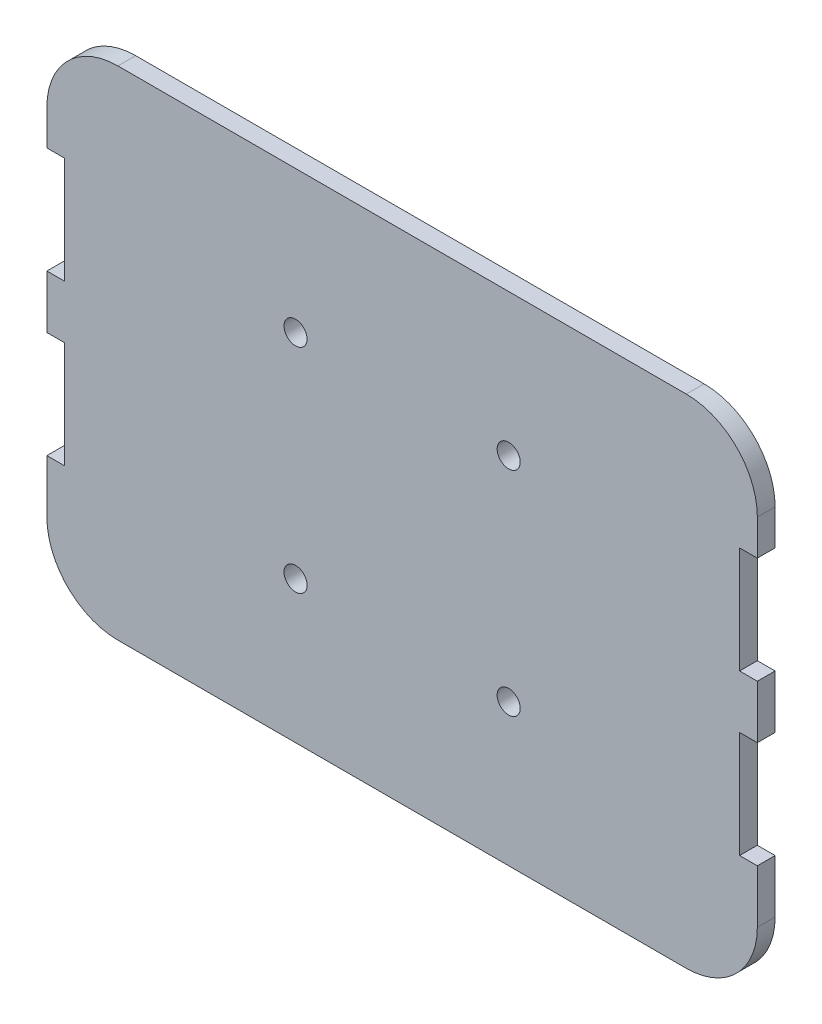
ISO-10303-21;
HEADER;
FILE_DESCRIPTION(('STEP AP214'),'2;1');
FILE_NAME('part.step','',(''),(''),'','','');
FILE_SCHEMA(('AUTOMOTIVE_DESIGN { 1 0 10303 214 1 1 1 1 }'));
ENDSEC;
DATA;
#1=APPLICATION_CONTEXT('core data for automotive mechanical design processes');
#2=APPLICATION_PROTOCOL_DEFINITION('international standard','automotive_design',2000,#1);
#3=PRODUCT_CONTEXT('',#1,'mechanical');
#4=PRODUCT('Part','Part','',(#3));
#5=PRODUCT_RELATED_PRODUCT_CATEGORY('part','',(#4));
#6=PRODUCT_DEFINITION_FORMATION('','',#4);
#7=PRODUCT_DEFINITION_CONTEXT('part definition',#1,'design');
#8=PRODUCT_DEFINITION('design','',#6,#7);
#9=PRODUCT_DEFINITION_SHAPE('','',#8);
#10=(LENGTH_UNIT() NAMED_UNIT(*) SI_UNIT(.MILLI.,.METRE.));
#11=(NAMED_UNIT(*) PLANE_ANGLE_UNIT() SI_UNIT($,.RADIAN.));
#12=(NAMED_UNIT(*) SI_UNIT($,.STERADIAN.) SOLID_ANGLE_UNIT());
#13=UNCERTAINTY_MEASURE_WITH_UNIT(LENGTH_MEASURE(1.E-05),#10,'distance_accuracy_value','');
#14=(GEOMETRIC_REPRESENTATION_CONTEXT(3) GLOBAL_UNCERTAINTY_ASSIGNED_CONTEXT((#13)) GLOBAL_UNIT_ASSIGNED_CONTEXT((#10,
#11,#12)) REPRESENTATION_CONTEXT('',''));
#15=CARTESIAN_POINT('',(0.,0.,0.));
#16=DIRECTION('',(0.,0.,1.));
#17=DIRECTION('',(1.,0.,0.));
#18=AXIS2_PLACEMENT_3D('',#15,#16,#17);
#19=CARTESIAN_POINT('',(-100.,120.,5.));
#20=DIRECTION('',(1.,0.,0.));
#21=DIRECTION('',(0.,0.,-1.));
#22=AXIS2_PLACEMENT_3D('',#19,#20,#21);
#23=PLANE('',#22);
#24=DIRECTION('',(0.,-1.,0.));
#25=VECTOR('',#24,1.);
#26=CARTESIAN_POINT('',(-100.,120.,0.));
#27=LINE('',#26,#25);
#28=CARTESIAN_POINT('',(-100.,100.,0.));
#29=VERTEX_POINT('',#28);
#30=CARTESIAN_POINT('',(-100.,90.,0.));
#31=VERTEX_POINT('',#30);
#32=EDGE_CURVE('E364',#29,#31,#27,.T.);
#33=ORIENTED_EDGE('',*,*,#32,.T.);
#34=DIRECTION('',(0.,0.,1.));
#35=VECTOR('',#34,1.);
#36=CARTESIAN_POINT('',(-100.,90.,5.));
#37=LINE('',#36,#35);
#38=CARTESIAN_POINT('',(-100.,90.,5.));
#39=VERTEX_POINT('',#38);
#40=EDGE_CURVE('E443',#31,#39,#37,.T.);
#41=ORIENTED_EDGE('',*,*,#40,.T.);
#42=DIRECTION('',(0.,-1.,0.));
#43=VECTOR('',#42,1.);
#44=CARTESIAN_POINT('',(-100.,120.,5.));
#45=LINE('',#44,#43);
#46=CARTESIAN_POINT('',(-100.,100.,5.));
#47=VERTEX_POINT('',#46);
#48=EDGE_CURVE('E373',#47,#39,#45,.T.);
#49=ORIENTED_EDGE('',*,*,#48,.F.);
#50=DIRECTION('',(0.,0.,-1.));
#51=VECTOR('',#50,1.);
#52=CARTESIAN_POINT('',(-100.,100.,0.));
#53=LINE('',#52,#51);
#54=EDGE_CURVE('E393',#47,#29,#53,.T.);
#55=ORIENTED_EDGE('',*,*,#54,.T.);
#56=EDGE_LOOP('',(#33,#41,#49,#55));
#57=FACE_BOUND('',#56,.T.);
#58=ADVANCED_FACE('F95',(#57),#23,.F.);
#59=CARTESIAN_POINT('',(-100.,60.,5.));
#60=VERTEX_POINT('',#59);
#61=CARTESIAN_POINT('',(-100.,45.,5.));
#62=VERTEX_POINT('',#61);
#63=EDGE_CURVE('E376',#60,#62,#45,.T.);
#64=ORIENTED_EDGE('',*,*,#63,.F.);
#65=DIRECTION('',(0.,0.,-1.));
#66=VECTOR('',#65,1.);
#67=CARTESIAN_POINT('',(-100.,60.,5.));
#68=LINE('',#67,#66);
#69=CARTESIAN_POINT('',(-100.,60.,0.));
#70=VERTEX_POINT('',#69);
#71=EDGE_CURVE('E441',#60,#70,#68,.T.);
#72=ORIENTED_EDGE('',*,*,#71,.T.);
#73=CARTESIAN_POINT('',(-100.,45.,0.));
#74=VERTEX_POINT('',#73);
#75=EDGE_CURVE('E390',#70,#74,#27,.T.);
#76=ORIENTED_EDGE('',*,*,#75,.T.);
#77=DIRECTION('',(0.,0.,1.));
#78=VECTOR('',#77,1.);
#79=CARTESIAN_POINT('',(-100.,45.,5.));
#80=LINE('',#79,#78);
#81=EDGE_CURVE('E438',#74,#62,#80,.T.);
#82=ORIENTED_EDGE('',*,*,#81,.T.);
#83=EDGE_LOOP('',(#64,#72,#76,#82));
#84=FACE_BOUND('',#83,.T.);
#85=ADVANCED_FACE('F469',(#84),#23,.F.);
#86=CARTESIAN_POINT('',(100.,120.,5.));
#87=DIRECTION('',(1.,0.,0.));
#88=DIRECTION('',(0.,1.,0.));
#89=AXIS2_PLACEMENT_3D('',#86,#87,#88);
#90=PLANE('',#89);
#91=DIRECTION('',(0.,0.,1.));
#92=VECTOR('',#91,1.);
#93=CARTESIAN_POINT('',(100.,45.,5.));
#94=LINE('',#93,#92);
#95=CARTESIAN_POINT('',(100.,45.,0.));
#96=VERTEX_POINT('',#95);
#97=CARTESIAN_POINT('',(100.,45.,5.));
#98=VERTEX_POINT('',#97);
#99=EDGE_CURVE('E434',#96,#98,#94,.T.);
#100=ORIENTED_EDGE('',*,*,#99,.F.);
#101=DIRECTION('',(0.,-1.,0.));
#102=VECTOR('',#101,1.);
#103=CARTESIAN_POINT('',(100.,120.,0.));
#104=LINE('',#103,#102);
#105=CARTESIAN_POINT('',(100.,60.,0.));
#106=VERTEX_POINT('',#105);
#107=EDGE_CURVE('E384',#106,#96,#104,.T.);
#108=ORIENTED_EDGE('',*,*,#107,.F.);
#109=DIRECTION('',(0.,0.,-1.));
#110=VECTOR('',#109,1.);
#111=CARTESIAN_POINT('',(100.,60.,5.));
#112=LINE('',#111,#110);
#113=CARTESIAN_POINT('',(100.,60.,5.));
#114=VERTEX_POINT('',#113);
#115=EDGE_CURVE('E428',#114,#106,#112,.T.);
#116=ORIENTED_EDGE('',*,*,#115,.F.);
#117=DIRECTION('',(0.,-1.,0.));
#118=VECTOR('',#117,1.);
#119=CARTESIAN_POINT('',(100.,120.,5.));
#120=LINE('',#119,#118);
#121=EDGE_CURVE('E369',#114,#98,#120,.T.);
#122=ORIENTED_EDGE('',*,*,#121,.T.);
#123=EDGE_LOOP('',(#100,#108,#116,#122));
#124=FACE_BOUND('',#123,.T.);
#125=ADVANCED_FACE('F500',(#124),#90,.T.);
#126=DIRECTION('',(0.,0.,1.));
#127=VECTOR('',#126,1.);
#128=CARTESIAN_POINT('',(100.,90.,5.));
#129=LINE('',#128,#127);
#130=CARTESIAN_POINT('',(100.,90.,0.));
#131=VERTEX_POINT('',#130);
#132=CARTESIAN_POINT('',(100.,90.,5.));
#133=VERTEX_POINT('',#132);
#134=EDGE_CURVE('E430',#131,#133,#129,.T.);
#135=ORIENTED_EDGE('',*,*,#134,.F.);
#136=CARTESIAN_POINT('',(100.,100.,0.));
#137=VERTEX_POINT('',#136);
#138=EDGE_CURVE('E380',#137,#131,#104,.T.);
#139=ORIENTED_EDGE('',*,*,#138,.F.);
#140=DIRECTION('',(0.,0.,-1.));
#141=VECTOR('',#140,1.);
#142=CARTESIAN_POINT('',(100.,100.,5.));
#143=LINE('',#142,#141);
#144=CARTESIAN_POINT('',(100.,100.,5.));
#145=VERTEX_POINT('',#144);
#146=EDGE_CURVE('E423',#137,#145,#143,.F.);
#147=ORIENTED_EDGE('',*,*,#146,.T.);
#148=EDGE_CURVE('E365',#145,#133,#120,.T.);
#149=ORIENTED_EDGE('',*,*,#148,.T.);
#150=EDGE_LOOP('',(#135,#139,#147,#149));
#151=FACE_BOUND('',#150,.T.);
#152=ADVANCED_FACE('F523',(#151),#90,.T.);
#153=CARTESIAN_POINT('',(0.,0.,5.));
#154=DIRECTION('',(0.,0.,-1.));
#155=DIRECTION('',(-1.,0.,0.));
#156=AXIS2_PLACEMENT_3D('',#153,#154,#155);
#157=PLANE('',#156);
#158=CARTESIAN_POINT('',(-30.,80.,5.));
#159=DIRECTION('',(0.,0.,-1.));
#160=DIRECTION('',(-1.,0.,0.));
#161=AXIS2_PLACEMENT_3D('',#158,#159,#160);
#162=CIRCLE('',#161,3.25000000000001);
#163=CARTESIAN_POINT('',(-33.25,80.,5.));
#164=VERTEX_POINT('',#163);
#165=EDGE_CURVE('E343',#164,#164,#162,.T.);
#166=ORIENTED_EDGE('',*,*,#165,.T.);
#167=EDGE_LOOP('',(#166));
#168=FACE_BOUND('',#167,.T.);
#169=CARTESIAN_POINT('',(30.,20.,5.));
#170=DIRECTION('',(0.,0.,-1.));
#171=DIRECTION('',(-1.,0.,0.));
#172=AXIS2_PLACEMENT_3D('',#169,#170,#171);
#173=CIRCLE('',#172,3.25000000000001);
#174=CARTESIAN_POINT('',(26.75,20.,5.));
#175=VERTEX_POINT('',#174);
#176=EDGE_CURVE('E355',#175,#175,#173,.T.);
#177=ORIENTED_EDGE('',*,*,#176,.T.);
#178=EDGE_LOOP('',(#177));
#179=FACE_BOUND('',#178,.T.);
#180=ORIENTED_EDGE('',*,*,#48,.T.);
#181=DIRECTION('',(-1.,0.,0.));
#182=VECTOR('',#181,1.);
#183=CARTESIAN_POINT('',(-94.9999999999999,90.,5.));
#184=LINE('',#183,#182);
#185=CARTESIAN_POINT('',(-94.9999999999999,90.,5.));
#186=VERTEX_POINT('',#185);
#187=EDGE_CURVE('E301',#186,#39,#184,.T.);
#188=ORIENTED_EDGE('',*,*,#187,.F.);
#189=DIRECTION('',(0.,1.,0.));
#190=VECTOR('',#189,1.);
#191=CARTESIAN_POINT('',(-94.9999999999999,90.,5.));
#192=LINE('',#191,#190);
#193=CARTESIAN_POINT('',(-94.9999999999999,60.,5.));
#194=VERTEX_POINT('',#193);
#195=EDGE_CURVE('E306',#194,#186,#192,.T.);
#196=ORIENTED_EDGE('',*,*,#195,.F.);
#197=DIRECTION('',(1.,0.,0.));
#198=VECTOR('',#197,1.);
#199=CARTESIAN_POINT('',(-94.9999999999999,60.,5.));
#200=LINE('',#199,#198);
#201=EDGE_CURVE('E303',#60,#194,#200,.T.);
#202=ORIENTED_EDGE('',*,*,#201,.F.);
#203=ORIENTED_EDGE('',*,*,#63,.T.);
#204=DIRECTION('',(-1.,0.,0.));
#205=VECTOR('',#204,1.);
#206=CARTESIAN_POINT('',(-95.,45.,5.));
#207=LINE('',#206,#205);
#208=CARTESIAN_POINT('',(-95.,45.,5.));
#209=VERTEX_POINT('',#208);
#210=EDGE_CURVE('E289',#209,#62,#207,.T.);
#211=ORIENTED_EDGE('',*,*,#210,.F.);
#212=DIRECTION('',(0.,1.,0.));
#213=VECTOR('',#212,1.);
#214=CARTESIAN_POINT('',(-95.,45.,5.));
#215=LINE('',#214,#213);
#216=CARTESIAN_POINT('',(-95.,15.,5.));
#217=VERTEX_POINT('',#216);
#218=EDGE_CURVE('E295',#217,#209,#215,.T.);
#219=ORIENTED_EDGE('',*,*,#218,.F.);
#220=DIRECTION('',(1.,0.,0.));
#221=VECTOR('',#220,1.);
#222=CARTESIAN_POINT('',(-95.,15.,5.));
#223=LINE('',#222,#221);
#224=CARTESIAN_POINT('',(-100.,15.,5.));
#225=VERTEX_POINT('',#224);
#226=EDGE_CURVE('E291',#225,#217,#223,.T.);
#227=ORIENTED_EDGE('',*,*,#226,.F.);
#228=CARTESIAN_POINT('',(-100.,0.,5.));
#229=VERTEX_POINT('',#228);
#230=EDGE_CURVE('E372',#225,#229,#45,.T.);
#231=ORIENTED_EDGE('',*,*,#230,.T.);
#232=CARTESIAN_POINT('',(-80.,0.,5.));
#233=DIRECTION('',(0.,0.,-1.));
#234=DIRECTION('',(-1.,0.,0.));
#235=AXIS2_PLACEMENT_3D('',#232,#233,#234);
#236=CIRCLE('',#235,20.);
#237=CARTESIAN_POINT('',(-80.,-20.,5.));
#238=VERTEX_POINT('',#237);
#239=EDGE_CURVE('E414',#229,#238,#236,.F.);
#240=ORIENTED_EDGE('',*,*,#239,.T.);
#241=DIRECTION('',(1.,0.,0.));
#242=VECTOR('',#241,1.);
#243=CARTESIAN_POINT('',(-100.,-20.,5.));
#244=LINE('',#243,#242);
#245=CARTESIAN_POINT('',(79.9999999999999,-20.,5.));
#246=VERTEX_POINT('',#245);
#247=EDGE_CURVE('E368',#238,#246,#244,.T.);
#248=ORIENTED_EDGE('',*,*,#247,.T.);
#249=CARTESIAN_POINT('',(80.,0.,5.));
#250=DIRECTION('',(0.,0.,-1.));
#251=DIRECTION('',(-1.,0.,0.));
#252=AXIS2_PLACEMENT_3D('',#249,#250,#251);
#253=CIRCLE('',#252,20.);
#254=CARTESIAN_POINT('',(100.,0.,5.));
#255=VERTEX_POINT('',#254);
#256=EDGE_CURVE('E412',#246,#255,#253,.F.);
#257=ORIENTED_EDGE('',*,*,#256,.T.);
#258=CARTESIAN_POINT('',(100.,15.,5.));
#259=VERTEX_POINT('',#258);
#260=EDGE_CURVE('E283',#259,#255,#120,.T.);
#261=ORIENTED_EDGE('',*,*,#260,.F.);
#262=DIRECTION('',(1.,0.,0.));
#263=VECTOR('',#262,1.);
#264=CARTESIAN_POINT('',(95.,15.,5.));
#265=LINE('',#264,#263);
#266=CARTESIAN_POINT('',(95.,15.,5.));
#267=VERTEX_POINT('',#266);
#268=EDGE_CURVE('E260',#267,#259,#265,.T.);
#269=ORIENTED_EDGE('',*,*,#268,.F.);
#270=DIRECTION('',(0.,-1.,0.));
#271=VECTOR('',#270,1.);
#272=CARTESIAN_POINT('',(95.,45.,5.));
#273=LINE('',#272,#271);
#274=CARTESIAN_POINT('',(95.,45.,5.));
#275=VERTEX_POINT('',#274);
#276=EDGE_CURVE('E270',#275,#267,#273,.T.);
#277=ORIENTED_EDGE('',*,*,#276,.F.);
#278=DIRECTION('',(-1.,0.,0.));
#279=VECTOR('',#278,1.);
#280=CARTESIAN_POINT('',(95.,45.,5.));
#281=LINE('',#280,#279);
#282=EDGE_CURVE('E267',#98,#275,#281,.T.);
#283=ORIENTED_EDGE('',*,*,#282,.F.);
#284=ORIENTED_EDGE('',*,*,#121,.F.);
#285=DIRECTION('',(1.,0.,0.));
#286=VECTOR('',#285,1.);
#287=CARTESIAN_POINT('',(95.,60.,5.));
#288=LINE('',#287,#286);
#289=CARTESIAN_POINT('',(95.,60.,5.));
#290=VERTEX_POINT('',#289);
#291=EDGE_CURVE('E314',#290,#114,#288,.T.);
#292=ORIENTED_EDGE('',*,*,#291,.F.);
#293=DIRECTION('',(0.,-1.,0.));
#294=VECTOR('',#293,1.);
#295=CARTESIAN_POINT('',(95.,90.,5.));
#296=LINE('',#295,#294);
#297=CARTESIAN_POINT('',(95.,90.,5.));
#298=VERTEX_POINT('',#297);
#299=EDGE_CURVE('E287',#298,#290,#296,.T.);
#300=ORIENTED_EDGE('',*,*,#299,.F.);
#301=DIRECTION('',(-1.,0.,0.));
#302=VECTOR('',#301,1.);
#303=CARTESIAN_POINT('',(95.,90.,5.));
#304=LINE('',#303,#302);
#305=EDGE_CURVE('E316',#133,#298,#304,.T.);
#306=ORIENTED_EDGE('',*,*,#305,.F.);
#307=ORIENTED_EDGE('',*,*,#148,.F.);
#308=CARTESIAN_POINT('',(80.,100.,5.));
#309=DIRECTION('',(0.,0.,-1.));
#310=DIRECTION('',(-1.,0.,0.));
#311=AXIS2_PLACEMENT_3D('',#308,#309,#310);
#312=CIRCLE('',#311,20.);
#313=CARTESIAN_POINT('',(80.,120.,5.));
#314=VERTEX_POINT('',#313);
#315=EDGE_CURVE('E410',#145,#314,#312,.F.);
#316=ORIENTED_EDGE('',*,*,#315,.T.);
#317=DIRECTION('',(1.,0.,0.));
#318=VECTOR('',#317,1.);
#319=CARTESIAN_POINT('',(-100.,120.,5.));
#320=LINE('',#319,#318);
#321=CARTESIAN_POINT('',(-80.,120.,5.));
#322=VERTEX_POINT('',#321);
#323=EDGE_CURVE('E361',#322,#314,#320,.T.);
#324=ORIENTED_EDGE('',*,*,#323,.F.);
#325=CARTESIAN_POINT('',(-80.,100.,5.));
#326=DIRECTION('',(0.,0.,-1.));
#327=DIRECTION('',(-1.,0.,0.));
#328=AXIS2_PLACEMENT_3D('',#325,#326,#327);
#329=CIRCLE('',#328,20.);
#330=EDGE_CURVE('E416',#322,#47,#329,.F.);
#331=ORIENTED_EDGE('',*,*,#330,.T.);
#332=EDGE_LOOP('',(#180,#188,#196,#202,#203,#211,#219,#227,#231,#240,#248,#257,#261,#269,#277,
#283,#284,#292,#300,#306,#307,#316,#324,#331));
#333=FACE_BOUND('',#332,.T.);
#334=CARTESIAN_POINT('',(-30.,20.,5.));
#335=DIRECTION('',(0.,0.,1.));
#336=DIRECTION('',(1.,0.,0.));
#337=AXIS2_PLACEMENT_3D('',#334,#335,#336);
#338=CIRCLE('',#337,3.25000000000001);
#339=CARTESIAN_POINT('',(-26.75,20.,5.));
#340=VERTEX_POINT('',#339);
#341=EDGE_CURVE('E349',#340,#340,#338,.T.);
#342=ORIENTED_EDGE('',*,*,#341,.F.);
#343=EDGE_LOOP('',(#342));
#344=FACE_BOUND('',#343,.T.);
#345=CARTESIAN_POINT('',(30.,80.,5.));
#346=DIRECTION('',(0.,0.,1.));
#347=DIRECTION('',(1.,0.,0.));
#348=AXIS2_PLACEMENT_3D('',#345,#346,#347);
#349=CIRCLE('',#348,3.25);
#350=CARTESIAN_POINT('',(33.25,80.,5.));
#351=VERTEX_POINT('',#350);
#352=EDGE_CURVE('E337',#351,#351,#349,.T.);
#353=ORIENTED_EDGE('',*,*,#352,.F.);
#354=EDGE_LOOP('',(#353));
#355=FACE_BOUND('',#354,.T.);
#356=ADVANCED_FACE('F280',(#168,#179,#333,#344,#355),#157,.F.);
#357=CARTESIAN_POINT('',(0.,0.,0.));
#358=DIRECTION('',(0.,0.,-1.));
#359=DIRECTION('',(-1.,0.,0.));
#360=AXIS2_PLACEMENT_3D('',#357,#358,#359);
#361=PLANE('',#360);
#362=DIRECTION('',(1.,0.,0.));
#363=VECTOR('',#362,1.);
#364=CARTESIAN_POINT('',(-4.99600361081315E-13,90.0000000000006,0.));
#365=LINE('',#364,#363);
#366=CARTESIAN_POINT('',(-94.9999999999999,90.,0.));
#367=VERTEX_POINT('',#366);
#368=EDGE_CURVE('E334',#31,#367,#365,.T.);
#369=ORIENTED_EDGE('',*,*,#368,.F.);
#370=ORIENTED_EDGE('',*,*,#32,.F.);
#371=CARTESIAN_POINT('',(-80.,100.,0.));
#372=DIRECTION('',(0.,0.,-1.));
#373=DIRECTION('',(-1.,0.,0.));
#374=AXIS2_PLACEMENT_3D('',#371,#372,#373);
#375=CIRCLE('',#374,20.);
#376=CARTESIAN_POINT('',(-80.,120.,0.));
#377=VERTEX_POINT('',#376);
#378=EDGE_CURVE('E403',#29,#377,#375,.T.);
#379=ORIENTED_EDGE('',*,*,#378,.T.);
#380=DIRECTION('',(1.,0.,0.));
#381=VECTOR('',#380,1.);
#382=CARTESIAN_POINT('',(-100.,120.,0.));
#383=LINE('',#382,#381);
#384=CARTESIAN_POINT('',(80.,120.,0.));
#385=VERTEX_POINT('',#384);
#386=EDGE_CURVE('E358',#377,#385,#383,.T.);
#387=ORIENTED_EDGE('',*,*,#386,.T.);
#388=CARTESIAN_POINT('',(80.,100.,0.));
#389=DIRECTION('',(0.,0.,-1.));
#390=DIRECTION('',(-1.,0.,0.));
#391=AXIS2_PLACEMENT_3D('',#388,#389,#390);
#392=CIRCLE('',#391,20.);
#393=EDGE_CURVE('E396',#385,#137,#392,.T.);
#394=ORIENTED_EDGE('',*,*,#393,.T.);
#395=ORIENTED_EDGE('',*,*,#138,.T.);
#396=DIRECTION('',(1.,0.,0.));
#397=VECTOR('',#396,1.);
#398=CARTESIAN_POINT('',(0.,90.,0.));
#399=LINE('',#398,#397);
#400=CARTESIAN_POINT('',(95.,90.,0.));
#401=VERTEX_POINT('',#400);
#402=EDGE_CURVE('E325',#401,#131,#399,.T.);
#403=ORIENTED_EDGE('',*,*,#402,.F.);
#404=DIRECTION('',(0.,1.,0.));
#405=VECTOR('',#404,1.);
#406=CARTESIAN_POINT('',(94.9999999999999,0.,0.));
#407=LINE('',#406,#405);
#408=CARTESIAN_POINT('',(95.,60.,0.));
#409=VERTEX_POINT('',#408);
#410=EDGE_CURVE('E446',#409,#401,#407,.T.);
#411=ORIENTED_EDGE('',*,*,#410,.F.);
#412=DIRECTION('',(-1.,0.,0.));
#413=VECTOR('',#412,1.);
#414=CARTESIAN_POINT('',(0.,60.,0.));
#415=LINE('',#414,#413);
#416=EDGE_CURVE('E322',#106,#409,#415,.T.);
#417=ORIENTED_EDGE('',*,*,#416,.F.);
#418=ORIENTED_EDGE('',*,*,#107,.T.);
#419=DIRECTION('',(1.,0.,0.));
#420=VECTOR('',#419,1.);
#421=CARTESIAN_POINT('',(0.,45.,0.));
#422=LINE('',#421,#420);
#423=CARTESIAN_POINT('',(95.,45.,0.));
#424=VERTEX_POINT('',#423);
#425=EDGE_CURVE('E328',#424,#96,#422,.T.);
#426=ORIENTED_EDGE('',*,*,#425,.F.);
#427=DIRECTION('',(0.,1.,0.));
#428=VECTOR('',#427,1.);
#429=CARTESIAN_POINT('',(95.,0.,0.));
#430=LINE('',#429,#428);
#431=CARTESIAN_POINT('',(95.,15.,0.));
#432=VERTEX_POINT('',#431);
#433=EDGE_CURVE('E448',#432,#424,#430,.T.);
#434=ORIENTED_EDGE('',*,*,#433,.F.);
#435=DIRECTION('',(-1.,0.,0.));
#436=VECTOR('',#435,1.);
#437=CARTESIAN_POINT('',(0.,15.,0.));
#438=LINE('',#437,#436);
#439=CARTESIAN_POINT('',(100.,15.,0.));
#440=VERTEX_POINT('',#439);
#441=EDGE_CURVE('E263',#440,#432,#438,.T.);
#442=ORIENTED_EDGE('',*,*,#441,.F.);
#443=CARTESIAN_POINT('',(100.,0.,0.));
#444=VERTEX_POINT('',#443);
#445=EDGE_CURVE('E379',#440,#444,#104,.T.);
#446=ORIENTED_EDGE('',*,*,#445,.T.);
#447=CARTESIAN_POINT('',(80.,0.,0.));
#448=DIRECTION('',(0.,0.,-1.));
#449=DIRECTION('',(-1.,0.,0.));
#450=AXIS2_PLACEMENT_3D('',#447,#448,#449);
#451=CIRCLE('',#450,20.);
#452=CARTESIAN_POINT('',(79.9999999999999,-20.,0.));
#453=VERTEX_POINT('',#452);
#454=EDGE_CURVE('E398',#444,#453,#451,.T.);
#455=ORIENTED_EDGE('',*,*,#454,.T.);
#456=DIRECTION('',(1.,0.,0.));
#457=VECTOR('',#456,1.);
#458=CARTESIAN_POINT('',(-100.,-20.,0.));
#459=LINE('',#458,#457);
#460=CARTESIAN_POINT('',(-80.,-20.,0.));
#461=VERTEX_POINT('',#460);
#462=EDGE_CURVE('E383',#461,#453,#459,.T.);
#463=ORIENTED_EDGE('',*,*,#462,.F.);
#464=CARTESIAN_POINT('',(-80.,0.,0.));
#465=DIRECTION('',(0.,0.,-1.));
#466=DIRECTION('',(-1.,0.,0.));
#467=AXIS2_PLACEMENT_3D('',#464,#465,#466);
#468=CIRCLE('',#467,20.);
#469=CARTESIAN_POINT('',(-100.,0.,0.));
#470=VERTEX_POINT('',#469);
#471=EDGE_CURVE('E400',#461,#470,#468,.T.);
#472=ORIENTED_EDGE('',*,*,#471,.T.);
#473=CARTESIAN_POINT('',(-100.,15.,0.));
#474=VERTEX_POINT('',#473);
#475=EDGE_CURVE('E387',#474,#470,#27,.T.);
#476=ORIENTED_EDGE('',*,*,#475,.F.);
#477=DIRECTION('',(-1.,0.,0.));
#478=VECTOR('',#477,1.);
#479=CARTESIAN_POINT('',(0.,14.9999999999995,0.));
#480=LINE('',#479,#478);
#481=CARTESIAN_POINT('',(-95.,15.,0.));
#482=VERTEX_POINT('',#481);
#483=EDGE_CURVE('E110',#482,#474,#480,.T.);
#484=ORIENTED_EDGE('',*,*,#483,.F.);
#485=DIRECTION('',(0.,-1.,0.));
#486=VECTOR('',#485,1.);
#487=CARTESIAN_POINT('',(-95.,0.,0.));
#488=LINE('',#487,#486);
#489=CARTESIAN_POINT('',(-95.,45.,0.));
#490=VERTEX_POINT('',#489);
#491=EDGE_CURVE('E103',#490,#482,#488,.T.);
#492=ORIENTED_EDGE('',*,*,#491,.F.);
#493=DIRECTION('',(1.,0.,0.));
#494=VECTOR('',#493,1.);
#495=CARTESIAN_POINT('',(1.87350135405492E-13,44.9999999999996,0.));
#496=LINE('',#495,#494);
#497=EDGE_CURVE('E331',#74,#490,#496,.T.);
#498=ORIENTED_EDGE('',*,*,#497,.F.);
#499=ORIENTED_EDGE('',*,*,#75,.F.);
#500=DIRECTION('',(-1.,0.,0.));
#501=VECTOR('',#500,1.);
#502=CARTESIAN_POINT('',(2.49800180540654E-13,59.9999999999996,0.));
#503=LINE('',#502,#501);
#504=CARTESIAN_POINT('',(-94.9999999999999,60.,0.));
#505=VERTEX_POINT('',#504);
#506=EDGE_CURVE('E118',#505,#70,#503,.T.);
#507=ORIENTED_EDGE('',*,*,#506,.F.);
#508=DIRECTION('',(0.,-1.,0.));
#509=VECTOR('',#508,1.);
#510=CARTESIAN_POINT('',(-94.9999999999999,0.,0.));
#511=LINE('',#510,#509);
#512=EDGE_CURVE('E12',#367,#505,#511,.T.);
#513=ORIENTED_EDGE('',*,*,#512,.F.);
#514=EDGE_LOOP('',(#369,#370,#379,#387,#394,#395,#403,#411,#417,#418,#426,#434,#442,#446,#455,
#463,#472,#476,#484,#492,#498,#499,#507,#513));
#515=FACE_BOUND('',#514,.T.);
#516=CARTESIAN_POINT('',(-30.,20.,0.));
#517=DIRECTION('',(0.,0.,1.));
#518=DIRECTION('',(1.,0.,0.));
#519=AXIS2_PLACEMENT_3D('',#516,#517,#518);
#520=CIRCLE('',#519,3.25000000000001);
#521=CARTESIAN_POINT('',(-26.75,20.,0.));
#522=VERTEX_POINT('',#521);
#523=EDGE_CURVE('E346',#522,#522,#520,.T.);
#524=ORIENTED_EDGE('',*,*,#523,.T.);
#525=EDGE_LOOP('',(#524));
#526=FACE_BOUND('',#525,.T.);
#527=CARTESIAN_POINT('',(30.,20.,0.));
#528=DIRECTION('',(0.,0.,-1.));
#529=DIRECTION('',(-1.,0.,0.));
#530=AXIS2_PLACEMENT_3D('',#527,#528,#529);
#531=CIRCLE('',#530,3.25000000000001);
#532=CARTESIAN_POINT('',(26.75,20.,0.));
#533=VERTEX_POINT('',#532);
#534=EDGE_CURVE('E352',#533,#533,#531,.T.);
#535=ORIENTED_EDGE('',*,*,#534,.F.);
#536=EDGE_LOOP('',(#535));
#537=FACE_BOUND('',#536,.T.);
#538=CARTESIAN_POINT('',(-30.,80.,0.));
#539=DIRECTION('',(0.,0.,-1.));
#540=DIRECTION('',(-1.,0.,0.));
#541=AXIS2_PLACEMENT_3D('',#538,#539,#540);
#542=CIRCLE('',#541,3.25000000000001);
#543=CARTESIAN_POINT('',(-33.25,80.,0.));
#544=VERTEX_POINT('',#543);
#545=EDGE_CURVE('E340',#544,#544,#542,.T.);
#546=ORIENTED_EDGE('',*,*,#545,.F.);
#547=EDGE_LOOP('',(#546));
#548=FACE_BOUND('',#547,.T.);
#549=CARTESIAN_POINT('',(30.,80.,0.));
#550=DIRECTION('',(0.,0.,1.));
#551=DIRECTION('',(1.,0.,0.));
#552=AXIS2_PLACEMENT_3D('',#549,#550,#551);
#553=CIRCLE('',#552,3.25);
#554=CARTESIAN_POINT('',(33.25,80.,0.));
#555=VERTEX_POINT('',#554);
#556=EDGE_CURVE('E336',#555,#555,#553,.T.);
#557=ORIENTED_EDGE('',*,*,#556,.T.);
#558=EDGE_LOOP('',(#557));
#559=FACE_BOUND('',#558,.T.);
#560=ADVANCED_FACE('F460',(#515,#526,#537,#548,#559),#361,.T.);
#561=CARTESIAN_POINT('',(-100.,120.,5.));
#562=DIRECTION('',(0.,1.,0.));
#563=DIRECTION('',(-1.,0.,0.));
#564=AXIS2_PLACEMENT_3D('',#561,#562,#563);
#565=PLANE('',#564);
#566=ORIENTED_EDGE('',*,*,#386,.F.);
#567=DIRECTION('',(0.,0.,-1.));
#568=VECTOR('',#567,1.);
#569=CARTESIAN_POINT('',(-80.,120.,5.));
#570=LINE('',#569,#568);
#571=EDGE_CURVE('E408',#377,#322,#570,.F.);
#572=ORIENTED_EDGE('',*,*,#571,.T.);
#573=ORIENTED_EDGE('',*,*,#323,.T.);
#574=DIRECTION('',(0.,0.,-1.));
#575=VECTOR('',#574,1.);
#576=CARTESIAN_POINT('',(80.,120.,5.));
#577=LINE('',#576,#575);
#578=EDGE_CURVE('E405',#314,#385,#577,.T.);
#579=ORIENTED_EDGE('',*,*,#578,.T.);
#580=EDGE_LOOP('',(#566,#572,#573,#579));
#581=FACE_BOUND('',#580,.T.);
#582=ADVANCED_FACE('F532',(#581),#565,.T.);
#583=ORIENTED_EDGE('',*,*,#230,.F.);
#584=DIRECTION('',(0.,0.,-1.));
#585=VECTOR('',#584,1.);
#586=CARTESIAN_POINT('',(-100.,15.,5.));
#587=LINE('',#586,#585);
#588=EDGE_CURVE('E436',#225,#474,#587,.T.);
#589=ORIENTED_EDGE('',*,*,#588,.T.);
#590=ORIENTED_EDGE('',*,*,#475,.T.);
#591=DIRECTION('',(0.,0.,-1.));
#592=VECTOR('',#591,1.);
#593=CARTESIAN_POINT('',(-100.,0.,5.));
#594=LINE('',#593,#592);
#595=EDGE_CURVE('E375',#470,#229,#594,.F.);
#596=ORIENTED_EDGE('',*,*,#595,.T.);
#597=EDGE_LOOP('',(#583,#589,#590,#596));
#598=FACE_BOUND('',#597,.T.);
#599=ADVANCED_FACE('F480',(#598),#23,.F.);
#600=CARTESIAN_POINT('',(-100.,-20.,5.));
#601=DIRECTION('',(0.,1.,0.));
#602=DIRECTION('',(0.,0.,1.));
#603=AXIS2_PLACEMENT_3D('',#600,#601,#602);
#604=PLANE('',#603);
#605=ORIENTED_EDGE('',*,*,#247,.F.);
#606=DIRECTION('',(0.,0.,-1.));
#607=VECTOR('',#606,1.);
#608=CARTESIAN_POINT('',(-80.,-20.,5.));
#609=LINE('',#608,#607);
#610=EDGE_CURVE('E420',#238,#461,#609,.T.);
#611=ORIENTED_EDGE('',*,*,#610,.T.);
#612=ORIENTED_EDGE('',*,*,#462,.T.);
#613=DIRECTION('',(0.,0.,-1.));
#614=VECTOR('',#613,1.);
#615=CARTESIAN_POINT('',(80.,-20.,5.));
#616=LINE('',#615,#614);
#617=EDGE_CURVE('E418',#453,#246,#616,.F.);
#618=ORIENTED_EDGE('',*,*,#617,.T.);
#619=EDGE_LOOP('',(#605,#611,#612,#618));
#620=FACE_BOUND('',#619,.T.);
#621=ADVANCED_FACE('F485',(#620),#604,.F.);
#622=DIRECTION('',(0.,0.,-1.));
#623=VECTOR('',#622,1.);
#624=CARTESIAN_POINT('',(100.,15.,5.));
#625=LINE('',#624,#623);
#626=EDGE_CURVE('E432',#259,#440,#625,.T.);
#627=ORIENTED_EDGE('',*,*,#626,.F.);
#628=ORIENTED_EDGE('',*,*,#260,.T.);
#629=DIRECTION('',(0.,0.,-1.));
#630=VECTOR('',#629,1.);
#631=CARTESIAN_POINT('',(100.,0.,0.));
#632=LINE('',#631,#630);
#633=EDGE_CURVE('E425',#255,#444,#632,.T.);
#634=ORIENTED_EDGE('',*,*,#633,.T.);
#635=ORIENTED_EDGE('',*,*,#445,.F.);
#636=EDGE_LOOP('',(#627,#628,#634,#635));
#637=FACE_BOUND('',#636,.T.);
#638=ADVANCED_FACE('F494',(#637),#90,.T.);
#639=CARTESIAN_POINT('',(30.,20.,5.));
#640=DIRECTION('',(0.,0.,-1.));
#641=DIRECTION('',(-1.,0.,0.));
#642=AXIS2_PLACEMENT_3D('',#639,#640,#641);
#643=CYLINDRICAL_SURFACE('',#642,3.25000000000001);
#644=ORIENTED_EDGE('',*,*,#176,.F.);
#645=EDGE_LOOP('',(#644));
#646=FACE_BOUND('',#645,.T.);
#647=ORIENTED_EDGE('',*,*,#534,.T.);
#648=EDGE_LOOP('',(#647));
#649=FACE_BOUND('',#648,.T.);
#650=ADVANCED_FACE('F601',(#646,#649),#643,.F.);
#651=CARTESIAN_POINT('',(-30.,20.,5.));
#652=DIRECTION('',(0.,0.,-1.));
#653=DIRECTION('',(-1.,0.,0.));
#654=AXIS2_PLACEMENT_3D('',#651,#652,#653);
#655=CYLINDRICAL_SURFACE('',#654,3.25000000000001);
#656=ORIENTED_EDGE('',*,*,#341,.T.);
#657=EDGE_LOOP('',(#656));
#658=FACE_BOUND('',#657,.T.);
#659=ORIENTED_EDGE('',*,*,#523,.F.);
#660=EDGE_LOOP('',(#659));
#661=FACE_BOUND('',#660,.T.);
#662=ADVANCED_FACE('F597',(#658,#661),#655,.F.);
#663=CARTESIAN_POINT('',(-30.,80.,5.));
#664=DIRECTION('',(0.,0.,-1.));
#665=DIRECTION('',(-1.,0.,0.));
#666=AXIS2_PLACEMENT_3D('',#663,#664,#665);
#667=CYLINDRICAL_SURFACE('',#666,3.25000000000001);
#668=ORIENTED_EDGE('',*,*,#165,.F.);
#669=EDGE_LOOP('',(#668));
#670=FACE_BOUND('',#669,.T.);
#671=ORIENTED_EDGE('',*,*,#545,.T.);
#672=EDGE_LOOP('',(#671));
#673=FACE_BOUND('',#672,.T.);
#674=ADVANCED_FACE('F593',(#670,#673),#667,.F.);
#675=CARTESIAN_POINT('',(30.,80.,5.));
#676=DIRECTION('',(0.,0.,-1.));
#677=DIRECTION('',(-1.,0.,0.));
#678=AXIS2_PLACEMENT_3D('',#675,#676,#677);
#679=CYLINDRICAL_SURFACE('',#678,3.25);
#680=ORIENTED_EDGE('',*,*,#352,.T.);
#681=EDGE_LOOP('',(#680));
#682=FACE_BOUND('',#681,.T.);
#683=ORIENTED_EDGE('',*,*,#556,.F.);
#684=EDGE_LOOP('',(#683));
#685=FACE_BOUND('',#684,.T.);
#686=ADVANCED_FACE('F574',(#682,#685),#679,.F.);
#687=CARTESIAN_POINT('',(-80.,100.,5.));
#688=DIRECTION('',(0.,0.,1.));
#689=DIRECTION('',(1.,0.,0.));
#690=AXIS2_PLACEMENT_3D('',#687,#688,#689);
#691=CYLINDRICAL_SURFACE('',#690,20.);
#692=ORIENTED_EDGE('',*,*,#330,.F.);
#693=ORIENTED_EDGE('',*,*,#571,.F.);
#694=ORIENTED_EDGE('',*,*,#378,.F.);
#695=ORIENTED_EDGE('',*,*,#54,.F.);
#696=EDGE_LOOP('',(#692,#693,#694,#695));
#697=FACE_BOUND('',#696,.T.);
#698=ADVANCED_FACE('F535',(#697),#691,.T.);
#699=CARTESIAN_POINT('',(-80.,0.,5.));
#700=DIRECTION('',(0.,0.,-1.));
#701=DIRECTION('',(-1.,0.,0.));
#702=AXIS2_PLACEMENT_3D('',#699,#700,#701);
#703=CYLINDRICAL_SURFACE('',#702,20.);
#704=ORIENTED_EDGE('',*,*,#239,.F.);
#705=ORIENTED_EDGE('',*,*,#595,.F.);
#706=ORIENTED_EDGE('',*,*,#471,.F.);
#707=ORIENTED_EDGE('',*,*,#610,.F.);
#708=EDGE_LOOP('',(#704,#705,#706,#707));
#709=FACE_BOUND('',#708,.T.);
#710=ADVANCED_FACE('F483',(#709),#703,.T.);
#711=CARTESIAN_POINT('',(80.,0.,5.));
#712=DIRECTION('',(0.,0.,1.));
#713=DIRECTION('',(1.,0.,0.));
#714=AXIS2_PLACEMENT_3D('',#711,#712,#713);
#715=CYLINDRICAL_SURFACE('',#714,20.);
#716=ORIENTED_EDGE('',*,*,#256,.F.);
#717=ORIENTED_EDGE('',*,*,#617,.F.);
#718=ORIENTED_EDGE('',*,*,#454,.F.);
#719=ORIENTED_EDGE('',*,*,#633,.F.);
#720=EDGE_LOOP('',(#716,#717,#718,#719));
#721=FACE_BOUND('',#720,.T.);
#722=ADVANCED_FACE('F492',(#721),#715,.T.);
#723=CARTESIAN_POINT('',(80.,100.,5.));
#724=DIRECTION('',(0.,0.,-1.));
#725=DIRECTION('',(-1.,0.,0.));
#726=AXIS2_PLACEMENT_3D('',#723,#724,#725);
#727=CYLINDRICAL_SURFACE('',#726,20.);
#728=ORIENTED_EDGE('',*,*,#315,.F.);
#729=ORIENTED_EDGE('',*,*,#146,.F.);
#730=ORIENTED_EDGE('',*,*,#393,.F.);
#731=ORIENTED_EDGE('',*,*,#578,.F.);
#732=EDGE_LOOP('',(#728,#729,#730,#731));
#733=FACE_BOUND('',#732,.T.);
#734=ADVANCED_FACE('F97',(#733),#727,.T.);
#735=CARTESIAN_POINT('',(95.,90.,-34.));
#736=DIRECTION('',(-1.,0.,0.));
#737=DIRECTION('',(0.,-1.,0.));
#738=AXIS2_PLACEMENT_3D('',#735,#736,#737);
#739=PLANE('',#738);
#740=ORIENTED_EDGE('',*,*,#410,.T.);
#741=DIRECTION('',(0.,0.,1.));
#742=VECTOR('',#741,1.);
#743=CARTESIAN_POINT('',(95.,90.,-34.));
#744=LINE('',#743,#742);
#745=EDGE_CURVE('E320',#401,#298,#744,.T.);
#746=ORIENTED_EDGE('',*,*,#745,.T.);
#747=ORIENTED_EDGE('',*,*,#299,.T.);
#748=DIRECTION('',(0.,0.,1.));
#749=VECTOR('',#748,1.);
#750=CARTESIAN_POINT('',(95.,60.,-34.));
#751=LINE('',#750,#749);
#752=EDGE_CURVE('E319',#409,#290,#751,.T.);
#753=ORIENTED_EDGE('',*,*,#752,.F.);
#754=EDGE_LOOP('',(#740,#746,#747,#753));
#755=FACE_BOUND('',#754,.T.);
#756=ADVANCED_FACE('F515',(#755),#739,.F.);
#757=CARTESIAN_POINT('',(95.,90.,-34.));
#758=DIRECTION('',(0.,1.,0.));
#759=DIRECTION('',(0.,0.,1.));
#760=AXIS2_PLACEMENT_3D('',#757,#758,#759);
#761=PLANE('',#760);
#762=ORIENTED_EDGE('',*,*,#402,.T.);
#763=ORIENTED_EDGE('',*,*,#134,.T.);
#764=ORIENTED_EDGE('',*,*,#305,.T.);
#765=ORIENTED_EDGE('',*,*,#745,.F.);
#766=EDGE_LOOP('',(#762,#763,#764,#765));
#767=FACE_BOUND('',#766,.T.);
#768=ADVANCED_FACE('F583',(#767),#761,.F.);
#769=CARTESIAN_POINT('',(95.,60.,-34.));
#770=DIRECTION('',(0.,-1.,0.));
#771=DIRECTION('',(0.,0.,-1.));
#772=AXIS2_PLACEMENT_3D('',#769,#770,#771);
#773=PLANE('',#772);
#774=ORIENTED_EDGE('',*,*,#416,.T.);
#775=ORIENTED_EDGE('',*,*,#752,.T.);
#776=ORIENTED_EDGE('',*,*,#291,.T.);
#777=ORIENTED_EDGE('',*,*,#115,.T.);
#778=EDGE_LOOP('',(#774,#775,#776,#777));
#779=FACE_BOUND('',#778,.T.);
#780=ADVANCED_FACE('F513',(#779),#773,.F.);
#781=CARTESIAN_POINT('',(95.,45.,-34.));
#782=DIRECTION('',(-1.,0.,0.));
#783=DIRECTION('',(0.,0.,1.));
#784=AXIS2_PLACEMENT_3D('',#781,#782,#783);
#785=PLANE('',#784);
#786=ORIENTED_EDGE('',*,*,#433,.T.);
#787=DIRECTION('',(0.,0.,1.));
#788=VECTOR('',#787,1.);
#789=CARTESIAN_POINT('',(95.,45.,-34.));
#790=LINE('',#789,#788);
#791=EDGE_CURVE('E266',#424,#275,#790,.T.);
#792=ORIENTED_EDGE('',*,*,#791,.T.);
#793=ORIENTED_EDGE('',*,*,#276,.T.);
#794=DIRECTION('',(0.,0.,1.));
#795=VECTOR('',#794,1.);
#796=CARTESIAN_POINT('',(95.,15.,-34.));
#797=LINE('',#796,#795);
#798=EDGE_CURVE('E256',#432,#267,#797,.T.);
#799=ORIENTED_EDGE('',*,*,#798,.F.);
#800=EDGE_LOOP('',(#786,#792,#793,#799));
#801=FACE_BOUND('',#800,.T.);
#802=ADVANCED_FACE('F271',(#801),#785,.F.);
#803=CARTESIAN_POINT('',(95.,45.,-34.));
#804=DIRECTION('',(0.,1.,0.));
#805=DIRECTION('',(0.,0.,1.));
#806=AXIS2_PLACEMENT_3D('',#803,#804,#805);
#807=PLANE('',#806);
#808=ORIENTED_EDGE('',*,*,#425,.T.);
#809=ORIENTED_EDGE('',*,*,#99,.T.);
#810=ORIENTED_EDGE('',*,*,#282,.T.);
#811=ORIENTED_EDGE('',*,*,#791,.F.);
#812=EDGE_LOOP('',(#808,#809,#810,#811));
#813=FACE_BOUND('',#812,.T.);
#814=ADVANCED_FACE('F506',(#813),#807,.F.);
#815=CARTESIAN_POINT('',(95.,15.,-34.));
#816=DIRECTION('',(0.,-1.,0.));
#817=DIRECTION('',(0.,0.,-1.));
#818=AXIS2_PLACEMENT_3D('',#815,#816,#817);
#819=PLANE('',#818);
#820=ORIENTED_EDGE('',*,*,#441,.T.);
#821=ORIENTED_EDGE('',*,*,#798,.T.);
#822=ORIENTED_EDGE('',*,*,#268,.T.);
#823=ORIENTED_EDGE('',*,*,#626,.T.);
#824=EDGE_LOOP('',(#820,#821,#822,#823));
#825=FACE_BOUND('',#824,.T.);
#826=ADVANCED_FACE('F258',(#825),#819,.F.);
#827=CARTESIAN_POINT('',(-95.,45.,-34.));
#828=DIRECTION('',(0.,1.,0.));
#829=DIRECTION('',(-1.,0.,0.));
#830=AXIS2_PLACEMENT_3D('',#827,#828,#829);
#831=PLANE('',#830);
#832=ORIENTED_EDGE('',*,*,#497,.T.);
#833=DIRECTION('',(0.,0.,1.));
#834=VECTOR('',#833,1.);
#835=CARTESIAN_POINT('',(-95.,45.,-34.));
#836=LINE('',#835,#834);
#837=EDGE_CURVE('E276',#490,#209,#836,.T.);
#838=ORIENTED_EDGE('',*,*,#837,.T.);
#839=ORIENTED_EDGE('',*,*,#210,.T.);
#840=ORIENTED_EDGE('',*,*,#81,.F.);
#841=EDGE_LOOP('',(#832,#838,#839,#840));
#842=FACE_BOUND('',#841,.T.);
#843=ADVANCED_FACE('F473',(#842),#831,.F.);
#844=CARTESIAN_POINT('',(-95.,45.,-34.));
#845=DIRECTION('',(1.,0.,0.));
#846=DIRECTION('',(0.,0.,-1.));
#847=AXIS2_PLACEMENT_3D('',#844,#845,#846);
#848=PLANE('',#847);
#849=ORIENTED_EDGE('',*,*,#491,.T.);
#850=DIRECTION('',(0.,0.,1.));
#851=VECTOR('',#850,1.);
#852=CARTESIAN_POINT('',(-95.,15.,-34.));
#853=LINE('',#852,#851);
#854=EDGE_CURVE('E298',#482,#217,#853,.T.);
#855=ORIENTED_EDGE('',*,*,#854,.T.);
#856=ORIENTED_EDGE('',*,*,#218,.T.);
#857=ORIENTED_EDGE('',*,*,#837,.F.);
#858=EDGE_LOOP('',(#849,#855,#856,#857));
#859=FACE_BOUND('',#858,.T.);
#860=ADVANCED_FACE('F452',(#859),#848,.F.);
#861=CARTESIAN_POINT('',(-95.,15.,-34.));
#862=DIRECTION('',(0.,-1.,0.));
#863=DIRECTION('',(1.,0.,0.));
#864=AXIS2_PLACEMENT_3D('',#861,#862,#863);
#865=PLANE('',#864);
#866=ORIENTED_EDGE('',*,*,#483,.T.);
#867=ORIENTED_EDGE('',*,*,#588,.F.);
#868=ORIENTED_EDGE('',*,*,#226,.T.);
#869=ORIENTED_EDGE('',*,*,#854,.F.);
#870=EDGE_LOOP('',(#866,#867,#868,#869));
#871=FACE_BOUND('',#870,.T.);
#872=ADVANCED_FACE('F455',(#871),#865,.F.);
#873=CARTESIAN_POINT('',(-94.9999999999999,90.,-34.));
#874=DIRECTION('',(0.,1.,0.));
#875=DIRECTION('',(-1.,0.,0.));
#876=AXIS2_PLACEMENT_3D('',#873,#874,#875);
#877=PLANE('',#876);
#878=ORIENTED_EDGE('',*,*,#368,.T.);
#879=DIRECTION('',(0.,0.,1.));
#880=VECTOR('',#879,1.);
#881=CARTESIAN_POINT('',(-94.9999999999999,90.,-34.));
#882=LINE('',#881,#880);
#883=EDGE_CURVE('E292',#367,#186,#882,.T.);
#884=ORIENTED_EDGE('',*,*,#883,.T.);
#885=ORIENTED_EDGE('',*,*,#187,.T.);
#886=ORIENTED_EDGE('',*,*,#40,.F.);
#887=EDGE_LOOP('',(#878,#884,#885,#886));
#888=FACE_BOUND('',#887,.T.);
#889=ADVANCED_FACE('F542',(#888),#877,.F.);
#890=CARTESIAN_POINT('',(-94.9999999999999,90.,-34.));
#891=DIRECTION('',(1.,0.,0.));
#892=DIRECTION('',(0.,0.,-1.));
#893=AXIS2_PLACEMENT_3D('',#890,#891,#892);
#894=PLANE('',#893);
#895=ORIENTED_EDGE('',*,*,#512,.T.);
#896=DIRECTION('',(0.,0.,1.));
#897=VECTOR('',#896,1.);
#898=CARTESIAN_POINT('',(-94.9999999999999,60.,-34.));
#899=LINE('',#898,#897);
#900=EDGE_CURVE('E309',#505,#194,#899,.T.);
#901=ORIENTED_EDGE('',*,*,#900,.T.);
#902=ORIENTED_EDGE('',*,*,#195,.T.);
#903=ORIENTED_EDGE('',*,*,#883,.F.);
#904=EDGE_LOOP('',(#895,#901,#902,#903));
#905=FACE_BOUND('',#904,.T.);
#906=ADVANCED_FACE('F545',(#905),#894,.F.);
#907=CARTESIAN_POINT('',(-94.9999999999999,60.,-34.));
#908=DIRECTION('',(0.,-1.,0.));
#909=DIRECTION('',(1.,0.,0.));
#910=AXIS2_PLACEMENT_3D('',#907,#908,#909);
#911=PLANE('',#910);
#912=ORIENTED_EDGE('',*,*,#506,.T.);
#913=ORIENTED_EDGE('',*,*,#71,.F.);
#914=ORIENTED_EDGE('',*,*,#201,.T.);
#915=ORIENTED_EDGE('',*,*,#900,.F.);
#916=EDGE_LOOP('',(#912,#913,#914,#915));
#917=FACE_BOUND('',#916,.T.);
#918=ADVANCED_FACE('F546',(#917),#911,.F.);
#919=CLOSED_SHELL('',(#58,#85,#125,#152,#356,#560,#582,#599,#621,#638,#650,#662,#674,#686,#698,
#710,#722,#734,#756,#768,#780,#802,#814,#826,#843,#860,#872,#889,#906,#918));
#920=MANIFOLD_SOLID_BREP('B2',#919);
#921=ADVANCED_BREP_SHAPE_REPRESENTATION('',(#18,#920),#14);
#922=SHAPE_DEFINITION_REPRESENTATION(#9,#921);
ENDSEC;
END-ISO-10303-21;
